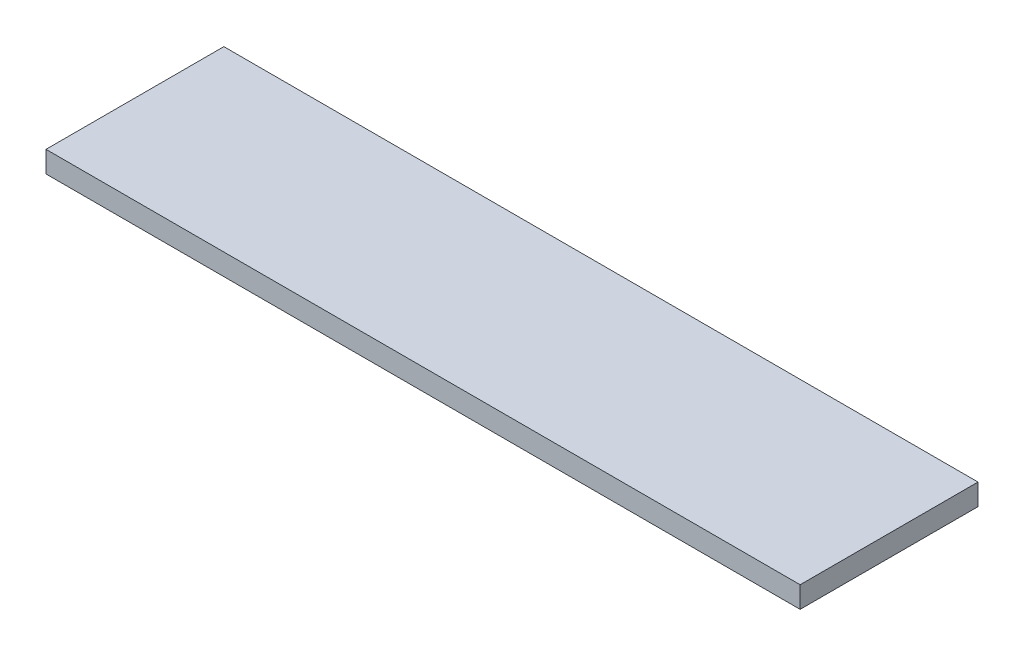
ISO-10303-21;
HEADER;
FILE_DESCRIPTION(('STEP AP214'),'2;1');
FILE_NAME('part.step','',(''),(''),'','','');
FILE_SCHEMA(('AUTOMOTIVE_DESIGN { 1 0 10303 214 1 1 1 1 }'));
ENDSEC;
DATA;
#1=APPLICATION_CONTEXT('core data for automotive mechanical design processes');
#2=APPLICATION_PROTOCOL_DEFINITION('international standard','automotive_design',2000,#1);
#3=PRODUCT_CONTEXT('',#1,'mechanical');
#4=PRODUCT('Part','Part','',(#3));
#5=PRODUCT_RELATED_PRODUCT_CATEGORY('part','',(#4));
#6=PRODUCT_DEFINITION_FORMATION('','',#4);
#7=PRODUCT_DEFINITION_CONTEXT('part definition',#1,'design');
#8=PRODUCT_DEFINITION('design','',#6,#7);
#9=PRODUCT_DEFINITION_SHAPE('','',#8);
#10=(LENGTH_UNIT() NAMED_UNIT(*) SI_UNIT(.MILLI.,.METRE.));
#11=(NAMED_UNIT(*) PLANE_ANGLE_UNIT() SI_UNIT($,.RADIAN.));
#12=(NAMED_UNIT(*) SI_UNIT($,.STERADIAN.) SOLID_ANGLE_UNIT());
#13=UNCERTAINTY_MEASURE_WITH_UNIT(LENGTH_MEASURE(1.E-05),#10,'distance_accuracy_value','');
#14=(GEOMETRIC_REPRESENTATION_CONTEXT(3) GLOBAL_UNCERTAINTY_ASSIGNED_CONTEXT((#13)) GLOBAL_UNIT_ASSIGNED_CONTEXT((#10,
#11,#12)) REPRESENTATION_CONTEXT('',''));
#15=CARTESIAN_POINT('',(0.,0.,0.));
#16=DIRECTION('',(0.,0.,1.));
#17=DIRECTION('',(1.,0.,0.));
#18=AXIS2_PLACEMENT_3D('',#15,#16,#17);
#19=CARTESIAN_POINT('',(0.,6.,0.));
#20=DIRECTION('',(1.,0.,0.));
#21=DIRECTION('',(0.,0.,-1.));
#22=AXIS2_PLACEMENT_3D('',#19,#20,#21);
#23=PLANE('',#22);
#24=DIRECTION('',(0.,0.,1.));
#25=VECTOR('',#24,1.);
#26=CARTESIAN_POINT('',(0.,0.,0.));
#27=LINE('',#26,#25);
#28=CARTESIAN_POINT('',(0.,0.,-50.));
#29=VERTEX_POINT('',#28);
#30=CARTESIAN_POINT('',(0.,0.,0.));
#31=VERTEX_POINT('',#30);
#32=EDGE_CURVE('E95',#29,#31,#27,.T.);
#33=ORIENTED_EDGE('',*,*,#32,.T.);
#34=DIRECTION('',(0.,-1.,0.));
#35=VECTOR('',#34,1.);
#36=CARTESIAN_POINT('',(0.,6.,0.));
#37=LINE('',#36,#35);
#38=CARTESIAN_POINT('',(0.,6.,0.));
#39=VERTEX_POINT('',#38);
#40=EDGE_CURVE('E11',#39,#31,#37,.T.);
#41=ORIENTED_EDGE('',*,*,#40,.F.);
#42=DIRECTION('',(0.,0.,1.));
#43=VECTOR('',#42,1.);
#44=CARTESIAN_POINT('',(0.,6.,0.));
#45=LINE('',#44,#43);
#46=CARTESIAN_POINT('',(0.,6.,-50.));
#47=VERTEX_POINT('',#46);
#48=EDGE_CURVE('E83',#47,#39,#45,.T.);
#49=ORIENTED_EDGE('',*,*,#48,.F.);
#50=DIRECTION('',(0.,-1.,0.));
#51=VECTOR('',#50,1.);
#52=CARTESIAN_POINT('',(0.,6.,-50.));
#53=LINE('',#52,#51);
#54=EDGE_CURVE('E91',#47,#29,#53,.T.);
#55=ORIENTED_EDGE('',*,*,#54,.T.);
#56=EDGE_LOOP('',(#33,#41,#49,#55));
#57=FACE_BOUND('',#56,.T.);
#58=ADVANCED_FACE('F32',(#57),#23,.F.);
#59=CARTESIAN_POINT('',(0.,6.,0.));
#60=DIRECTION('',(0.,0.,-1.));
#61=DIRECTION('',(-1.,0.,0.));
#62=AXIS2_PLACEMENT_3D('',#59,#60,#61);
#63=PLANE('',#62);
#64=DIRECTION('',(1.,0.,0.));
#65=VECTOR('',#64,1.);
#66=CARTESIAN_POINT('',(0.,0.,0.));
#67=LINE('',#66,#65);
#68=CARTESIAN_POINT('',(212.,0.,0.));
#69=VERTEX_POINT('',#68);
#70=EDGE_CURVE('E87',#31,#69,#67,.T.);
#71=ORIENTED_EDGE('',*,*,#70,.T.);
#72=DIRECTION('',(0.,-1.,0.));
#73=VECTOR('',#72,1.);
#74=CARTESIAN_POINT('',(212.,6.,0.));
#75=LINE('',#74,#73);
#76=CARTESIAN_POINT('',(212.,6.,0.));
#77=VERTEX_POINT('',#76);
#78=EDGE_CURVE('E40',#77,#69,#75,.T.);
#79=ORIENTED_EDGE('',*,*,#78,.F.);
#80=DIRECTION('',(1.,0.,0.));
#81=VECTOR('',#80,1.);
#82=CARTESIAN_POINT('',(0.,6.,0.));
#83=LINE('',#82,#81);
#84=EDGE_CURVE('E78',#39,#77,#83,.T.);
#85=ORIENTED_EDGE('',*,*,#84,.F.);
#86=ORIENTED_EDGE('',*,*,#40,.T.);
#87=EDGE_LOOP('',(#71,#79,#85,#86));
#88=FACE_BOUND('',#87,.T.);
#89=ADVANCED_FACE('F86',(#88),#63,.F.);
#90=CARTESIAN_POINT('',(212.,6.,0.));
#91=DIRECTION('',(-1.,0.,0.));
#92=DIRECTION('',(0.,0.,1.));
#93=AXIS2_PLACEMENT_3D('',#90,#91,#92);
#94=PLANE('',#93);
#95=DIRECTION('',(0.,0.,-1.));
#96=VECTOR('',#95,1.);
#97=CARTESIAN_POINT('',(212.,0.,0.));
#98=LINE('',#97,#96);
#99=CARTESIAN_POINT('',(212.,0.,-50.));
#100=VERTEX_POINT('',#99);
#101=EDGE_CURVE('E65',#69,#100,#98,.T.);
#102=ORIENTED_EDGE('',*,*,#101,.T.);
#103=DIRECTION('',(0.,-1.,0.));
#104=VECTOR('',#103,1.);
#105=CARTESIAN_POINT('',(212.,6.,-50.));
#106=LINE('',#105,#104);
#107=CARTESIAN_POINT('',(212.,6.,-50.));
#108=VERTEX_POINT('',#107);
#109=EDGE_CURVE('E88',#108,#100,#106,.T.);
#110=ORIENTED_EDGE('',*,*,#109,.F.);
#111=DIRECTION('',(0.,0.,-1.));
#112=VECTOR('',#111,1.);
#113=CARTESIAN_POINT('',(212.,6.,0.));
#114=LINE('',#113,#112);
#115=EDGE_CURVE('E81',#77,#108,#114,.T.);
#116=ORIENTED_EDGE('',*,*,#115,.F.);
#117=ORIENTED_EDGE('',*,*,#78,.T.);
#118=EDGE_LOOP('',(#102,#110,#116,#117));
#119=FACE_BOUND('',#118,.T.);
#120=ADVANCED_FACE('F89',(#119),#94,.F.);
#121=CARTESIAN_POINT('',(0.,6.,-50.));
#122=DIRECTION('',(0.,0.,1.));
#123=DIRECTION('',(1.,0.,0.));
#124=AXIS2_PLACEMENT_3D('',#121,#122,#123);
#125=PLANE('',#124);
#126=DIRECTION('',(-1.,0.,0.));
#127=VECTOR('',#126,1.);
#128=CARTESIAN_POINT('',(0.,0.,-50.));
#129=LINE('',#128,#127);
#130=EDGE_CURVE('E71',#100,#29,#129,.T.);
#131=ORIENTED_EDGE('',*,*,#130,.T.);
#132=ORIENTED_EDGE('',*,*,#54,.F.);
#133=DIRECTION('',(-1.,0.,0.));
#134=VECTOR('',#133,1.);
#135=CARTESIAN_POINT('',(0.,6.,-50.));
#136=LINE('',#135,#134);
#137=EDGE_CURVE('E48',#108,#47,#136,.T.);
#138=ORIENTED_EDGE('',*,*,#137,.F.);
#139=ORIENTED_EDGE('',*,*,#109,.T.);
#140=EDGE_LOOP('',(#131,#132,#138,#139));
#141=FACE_BOUND('',#140,.T.);
#142=ADVANCED_FACE('F102',(#141),#125,.F.);
#143=CARTESIAN_POINT('',(0.,6.,0.));
#144=DIRECTION('',(0.,-1.,0.));
#145=DIRECTION('',(0.,0.,-1.));
#146=AXIS2_PLACEMENT_3D('',#143,#144,#145);
#147=PLANE('',#146);
#148=ORIENTED_EDGE('',*,*,#48,.T.);
#149=ORIENTED_EDGE('',*,*,#84,.T.);
#150=ORIENTED_EDGE('',*,*,#115,.T.);
#151=ORIENTED_EDGE('',*,*,#137,.T.);
#152=EDGE_LOOP('',(#148,#149,#150,#151));
#153=FACE_BOUND('',#152,.T.);
#154=ADVANCED_FACE('F79',(#153),#147,.F.);
#155=CARTESIAN_POINT('',(0.,0.,0.));
#156=DIRECTION('',(0.,-1.,0.));
#157=DIRECTION('',(0.,0.,-1.));
#158=AXIS2_PLACEMENT_3D('',#155,#156,#157);
#159=PLANE('',#158);
#160=ORIENTED_EDGE('',*,*,#32,.F.);
#161=ORIENTED_EDGE('',*,*,#130,.F.);
#162=ORIENTED_EDGE('',*,*,#101,.F.);
#163=ORIENTED_EDGE('',*,*,#70,.F.);
#164=EDGE_LOOP('',(#160,#161,#162,#163));
#165=FACE_BOUND('',#164,.T.);
#166=ADVANCED_FACE('F105',(#165),#159,.T.);
#167=CLOSED_SHELL('',(#58,#89,#120,#142,#154,#166));
#168=MANIFOLD_SOLID_BREP('B2',#167);
#169=ADVANCED_BREP_SHAPE_REPRESENTATION('',(#18,#168),#14);
#170=SHAPE_DEFINITION_REPRESENTATION(#9,#169);
ENDSEC;
END-ISO-10303-21;
